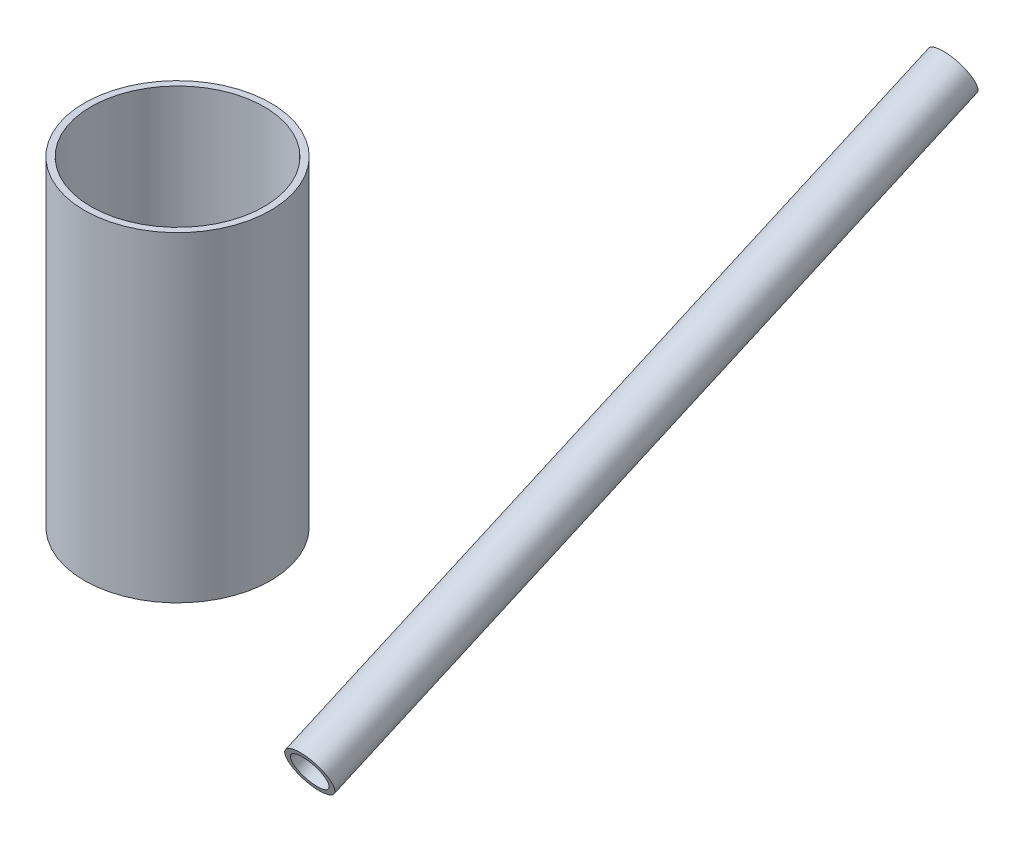
ISO-10303-21;
HEADER;
FILE_DESCRIPTION(('STEP AP214'),'2;1');
FILE_NAME('part.step','',(''),(''),'','','');
FILE_SCHEMA(('AUTOMOTIVE_DESIGN { 1 0 10303 214 1 1 1 1 }'));
ENDSEC;
DATA;
#1=APPLICATION_CONTEXT('core data for automotive mechanical design processes');
#2=APPLICATION_PROTOCOL_DEFINITION('international standard','automotive_design',2000,#1);
#3=PRODUCT_CONTEXT('',#1,'mechanical');
#4=PRODUCT('Part','Part','',(#3));
#5=PRODUCT_RELATED_PRODUCT_CATEGORY('part','',(#4));
#6=PRODUCT_DEFINITION_FORMATION('','',#4);
#7=PRODUCT_DEFINITION_CONTEXT('part definition',#1,'design');
#8=PRODUCT_DEFINITION('design','',#6,#7);
#9=PRODUCT_DEFINITION_SHAPE('','',#8);
#10=(LENGTH_UNIT() NAMED_UNIT(*) SI_UNIT(.MILLI.,.METRE.));
#11=(NAMED_UNIT(*) PLANE_ANGLE_UNIT() SI_UNIT($,.RADIAN.));
#12=(NAMED_UNIT(*) SI_UNIT($,.STERADIAN.) SOLID_ANGLE_UNIT());
#13=UNCERTAINTY_MEASURE_WITH_UNIT(LENGTH_MEASURE(1.E-05),#10,'distance_accuracy_value','');
#14=(GEOMETRIC_REPRESENTATION_CONTEXT(3) GLOBAL_UNCERTAINTY_ASSIGNED_CONTEXT((#13)) GLOBAL_UNIT_ASSIGNED_CONTEXT((#10,
#11,#12)) REPRESENTATION_CONTEXT('',''));
#15=CARTESIAN_POINT('',(0.,0.,0.));
#16=DIRECTION('',(0.,0.,1.));
#17=DIRECTION('',(1.,0.,0.));
#18=AXIS2_PLACEMENT_3D('',#15,#16,#17);
#19=CARTESIAN_POINT('',(0.,53.8905865532091,-49.1657565313626));
#20=DIRECTION('',(0.,-0.406138466053448,0.913811548620257));
#21=DIRECTION('',(0.,-0.913811548620257,-0.406138466053448));
#22=AXIS2_PLACEMENT_3D('',#19,#20,#21);
#23=CYLINDRICAL_SURFACE('',#22,2.4638);
#24=CARTESIAN_POINT('',(0.,53.8905865532091,-49.1657565313626));
#25=DIRECTION('',(0.,0.406138466053448,-0.913811548620257));
#26=DIRECTION('',(0.,0.913811548620257,0.406138466053448));
#27=AXIS2_PLACEMENT_3D('',#24,#25,#26);
#28=CIRCLE('',#27,2.4638);
#29=CARTESIAN_POINT('',(0.,56.1420354466996,-48.1651125787001));
#30=VERTEX_POINT('',#29);
#31=EDGE_CURVE('E68',#30,#30,#28,.T.);
#32=ORIENTED_EDGE('',*,*,#31,.T.);
#33=EDGE_LOOP('',(#32));
#34=FACE_BOUND('',#33,.T.);
#35=CARTESIAN_POINT('',(0.,14.9081269728518,38.5447775244413));
#36=DIRECTION('',(0.,0.406138466053448,-0.913811548620257));
#37=DIRECTION('',(0.,0.913811548620257,0.406138466053448));
#38=AXIS2_PLACEMENT_3D('',#35,#36,#37);
#39=CIRCLE('',#38,2.4638);
#40=CARTESIAN_POINT('',(0.,17.1595758663424,39.5454214771038));
#41=VERTEX_POINT('',#40);
#42=EDGE_CURVE('E74',#41,#41,#39,.T.);
#43=ORIENTED_EDGE('',*,*,#42,.F.);
#44=EDGE_LOOP('',(#43));
#45=FACE_BOUND('',#44,.T.);
#46=ADVANCED_FACE('F61',(#34,#45),#23,.F.);
#47=CARTESIAN_POINT('',(0.,53.8905865532091,-49.1657565313626));
#48=DIRECTION('',(0.,-0.406138466053448,0.913811548620257));
#49=DIRECTION('',(0.,-0.913811548620257,-0.406138466053448));
#50=AXIS2_PLACEMENT_3D('',#47,#48,#49);
#51=CYLINDRICAL_SURFACE('',#50,3.175);
#52=CARTESIAN_POINT('',(0.,53.8905865532091,-49.1657565313626));
#53=DIRECTION('',(0.,0.406138466053448,-0.913811548620257));
#54=DIRECTION('',(0.,0.913811548620257,0.406138466053448));
#55=AXIS2_PLACEMENT_3D('',#52,#53,#54);
#56=CIRCLE('',#55,3.175);
#57=CARTESIAN_POINT('',(0.,56.7919382200784,-47.8762669016429));
#58=VERTEX_POINT('',#57);
#59=EDGE_CURVE('E12',#58,#58,#56,.T.);
#60=ORIENTED_EDGE('',*,*,#59,.F.);
#61=EDGE_LOOP('',(#60));
#62=FACE_BOUND('',#61,.T.);
#63=CARTESIAN_POINT('',(0.,14.9081269728518,38.5447775244413));
#64=DIRECTION('',(0.,0.406138466053448,-0.913811548620257));
#65=DIRECTION('',(0.,0.913811548620257,0.406138466053448));
#66=AXIS2_PLACEMENT_3D('',#63,#64,#65);
#67=CIRCLE('',#66,3.175);
#68=CARTESIAN_POINT('',(0.,17.8094786397211,39.834267154161));
#69=VERTEX_POINT('',#68);
#70=EDGE_CURVE('E64',#69,#69,#67,.T.);
#71=ORIENTED_EDGE('',*,*,#70,.T.);
#72=EDGE_LOOP('',(#71));
#73=FACE_BOUND('',#72,.T.);
#74=ADVANCED_FACE('F81',(#62,#73),#51,.T.);
#75=CARTESIAN_POINT('',(0.,53.8905865532091,-49.1657565313626));
#76=DIRECTION('',(0.,0.406138466053448,-0.913811548620257));
#77=DIRECTION('',(0.,0.913811548620257,0.406138466053448));
#78=AXIS2_PLACEMENT_3D('',#75,#76,#77);
#79=PLANE('',#78);
#80=ORIENTED_EDGE('',*,*,#31,.F.);
#81=EDGE_LOOP('',(#80));
#82=FACE_BOUND('',#81,.T.);
#83=ORIENTED_EDGE('',*,*,#59,.T.);
#84=EDGE_LOOP('',(#83));
#85=FACE_BOUND('',#84,.T.);
#86=ADVANCED_FACE('F85',(#82,#85),#79,.T.);
#87=CARTESIAN_POINT('',(0.,14.9081269728518,38.5447775244413));
#88=DIRECTION('',(0.,0.406138466053448,-0.913811548620257));
#89=DIRECTION('',(0.,0.913811548620257,0.406138466053448));
#90=AXIS2_PLACEMENT_3D('',#87,#88,#89);
#91=PLANE('',#90);
#92=ORIENTED_EDGE('',*,*,#42,.T.);
#93=EDGE_LOOP('',(#92));
#94=FACE_BOUND('',#93,.T.);
#95=ORIENTED_EDGE('',*,*,#70,.F.);
#96=EDGE_LOOP('',(#95));
#97=FACE_BOUND('',#96,.T.);
#98=ADVANCED_FACE('F83',(#94,#97),#91,.F.);
#99=CLOSED_SHELL('',(#46,#74,#86,#98));
#100=MANIFOLD_SOLID_BREP('B2',#99);
#101=CARTESIAN_POINT('',(-56.579503991406,39.989242651553,0.));
#102=DIRECTION('',(0.,-1.,0.));
#103=DIRECTION('',(0.,0.,-1.));
#104=AXIS2_PLACEMENT_3D('',#101,#102,#103);
#105=CYLINDRICAL_SURFACE('',#104,11.811);
#106=CARTESIAN_POINT('',(-56.579503991406,39.989242651553,0.));
#107=DIRECTION('',(0.,1.,0.));
#108=DIRECTION('',(0.,0.,1.));
#109=AXIS2_PLACEMENT_3D('',#106,#107,#108);
#110=CIRCLE('',#109,11.811);
#111=CARTESIAN_POINT('',(-56.579503991406,39.989242651553,11.811));
#112=VERTEX_POINT('',#111);
#113=EDGE_CURVE('E139',#112,#112,#110,.T.);
#114=ORIENTED_EDGE('',*,*,#113,.T.);
#115=EDGE_LOOP('',(#114));
#116=FACE_BOUND('',#115,.T.);
#117=CARTESIAN_POINT('',(-56.579503991406,-3.74000111129633,0.));
#118=DIRECTION('',(0.,1.,0.));
#119=DIRECTION('',(0.,0.,1.));
#120=AXIS2_PLACEMENT_3D('',#117,#118,#119);
#121=CIRCLE('',#120,11.811);
#122=CARTESIAN_POINT('',(-56.579503991406,-3.74000111129633,11.811));
#123=VERTEX_POINT('',#122);
#124=EDGE_CURVE('E146',#123,#123,#121,.T.);
#125=ORIENTED_EDGE('',*,*,#124,.F.);
#126=EDGE_LOOP('',(#125));
#127=FACE_BOUND('',#126,.T.);
#128=ADVANCED_FACE('F131',(#116,#127),#105,.F.);
#129=CARTESIAN_POINT('',(-56.579503991406,39.989242651553,0.));
#130=DIRECTION('',(0.,-1.,0.));
#131=DIRECTION('',(0.,0.,-1.));
#132=AXIS2_PLACEMENT_3D('',#129,#130,#131);
#133=CYLINDRICAL_SURFACE('',#132,12.7);
#134=CARTESIAN_POINT('',(-56.579503991406,39.989242651553,0.));
#135=DIRECTION('',(0.,1.,0.));
#136=DIRECTION('',(0.,0.,1.));
#137=AXIS2_PLACEMENT_3D('',#134,#135,#136);
#138=CIRCLE('',#137,12.7);
#139=CARTESIAN_POINT('',(-56.579503991406,39.989242651553,12.7));
#140=VERTEX_POINT('',#139);
#141=EDGE_CURVE('E60',#140,#140,#138,.T.);
#142=ORIENTED_EDGE('',*,*,#141,.F.);
#143=EDGE_LOOP('',(#142));
#144=FACE_BOUND('',#143,.T.);
#145=CARTESIAN_POINT('',(-56.579503991406,-3.74000111129633,0.));
#146=DIRECTION('',(0.,1.,0.));
#147=DIRECTION('',(0.,0.,1.));
#148=AXIS2_PLACEMENT_3D('',#145,#146,#147);
#149=CIRCLE('',#148,12.7);
#150=CARTESIAN_POINT('',(-56.579503991406,-3.74000111129633,12.7));
#151=VERTEX_POINT('',#150);
#152=EDGE_CURVE('E134',#151,#151,#149,.T.);
#153=ORIENTED_EDGE('',*,*,#152,.T.);
#154=EDGE_LOOP('',(#153));
#155=FACE_BOUND('',#154,.T.);
#156=ADVANCED_FACE('F155',(#144,#155),#133,.T.);
#157=CARTESIAN_POINT('',(-56.579503991406,39.989242651553,0.));
#158=DIRECTION('',(0.,1.,0.));
#159=DIRECTION('',(0.,0.,1.));
#160=AXIS2_PLACEMENT_3D('',#157,#158,#159);
#161=PLANE('',#160);
#162=ORIENTED_EDGE('',*,*,#113,.F.);
#163=EDGE_LOOP('',(#162));
#164=FACE_BOUND('',#163,.T.);
#165=ORIENTED_EDGE('',*,*,#141,.T.);
#166=EDGE_LOOP('',(#165));
#167=FACE_BOUND('',#166,.T.);
#168=ADVANCED_FACE('F159',(#164,#167),#161,.T.);
#169=CARTESIAN_POINT('',(-56.579503991406,-3.74000111129633,0.));
#170=DIRECTION('',(0.,1.,0.));
#171=DIRECTION('',(0.,0.,1.));
#172=AXIS2_PLACEMENT_3D('',#169,#170,#171);
#173=PLANE('',#172);
#174=ORIENTED_EDGE('',*,*,#124,.T.);
#175=EDGE_LOOP('',(#174));
#176=FACE_BOUND('',#175,.T.);
#177=ORIENTED_EDGE('',*,*,#152,.F.);
#178=EDGE_LOOP('',(#177));
#179=FACE_BOUND('',#178,.T.);
#180=ADVANCED_FACE('F157',(#176,#179),#173,.F.);
#181=CLOSED_SHELL('',(#128,#156,#168,#180));
#182=MANIFOLD_SOLID_BREP('B7',#181);
#183=ADVANCED_BREP_SHAPE_REPRESENTATION('',(#18,#100,#182),#14);
#184=SHAPE_DEFINITION_REPRESENTATION(#9,#183);
ENDSEC;
END-ISO-10303-21;
